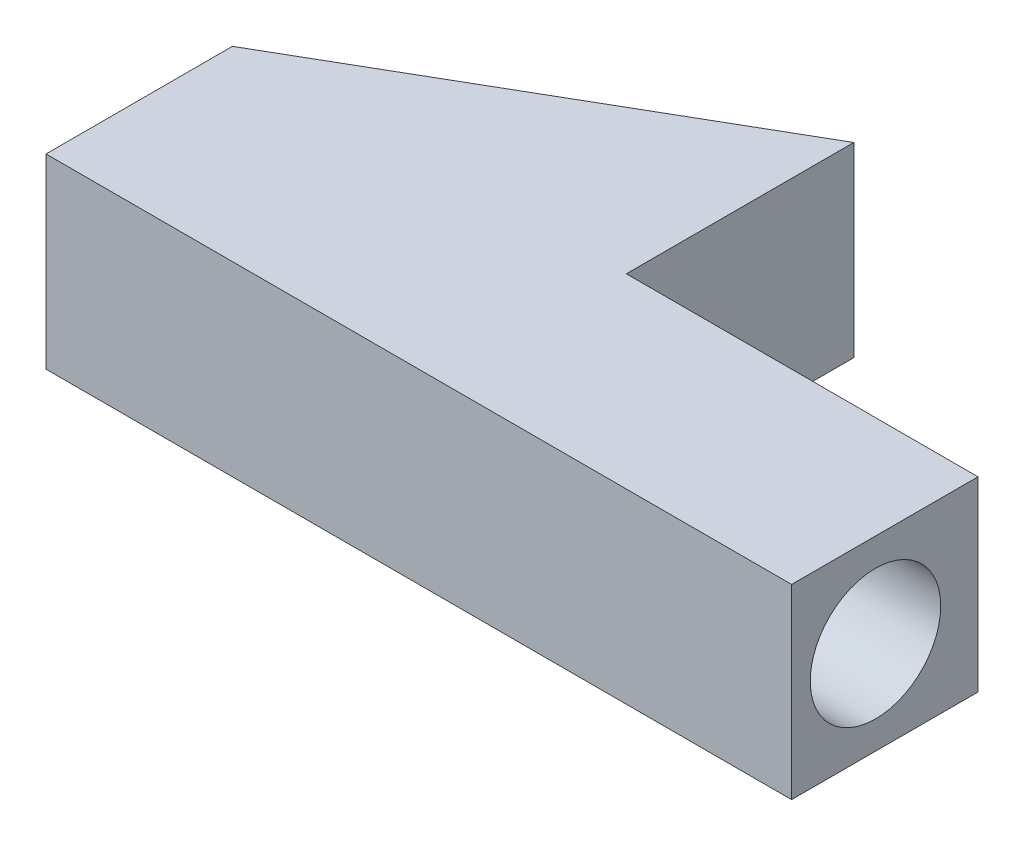
ISO-10303-21;
HEADER;
FILE_DESCRIPTION(('STEP AP214'),'2;1');
FILE_NAME('part.step','',(''),(''),'','','');
FILE_SCHEMA(('AUTOMOTIVE_DESIGN { 1 0 10303 214 1 1 1 1 }'));
ENDSEC;
DATA;
#1=APPLICATION_CONTEXT('core data for automotive mechanical design processes');
#2=APPLICATION_PROTOCOL_DEFINITION('international standard','automotive_design',2000,#1);
#3=PRODUCT_CONTEXT('',#1,'mechanical');
#4=PRODUCT('Part','Part','',(#3));
#5=PRODUCT_RELATED_PRODUCT_CATEGORY('part','',(#4));
#6=PRODUCT_DEFINITION_FORMATION('','',#4);
#7=PRODUCT_DEFINITION_CONTEXT('part definition',#1,'design');
#8=PRODUCT_DEFINITION('design','',#6,#7);
#9=PRODUCT_DEFINITION_SHAPE('','',#8);
#10=(LENGTH_UNIT() NAMED_UNIT(*) SI_UNIT(.MILLI.,.METRE.));
#11=(NAMED_UNIT(*) PLANE_ANGLE_UNIT() SI_UNIT($,.RADIAN.));
#12=(NAMED_UNIT(*) SI_UNIT($,.STERADIAN.) SOLID_ANGLE_UNIT());
#13=UNCERTAINTY_MEASURE_WITH_UNIT(LENGTH_MEASURE(1.E-05),#10,'distance_accuracy_value','');
#14=(GEOMETRIC_REPRESENTATION_CONTEXT(3) GLOBAL_UNCERTAINTY_ASSIGNED_CONTEXT((#13)) GLOBAL_UNIT_ASSIGNED_CONTEXT((#10,
#11,#12)) REPRESENTATION_CONTEXT('',''));
#15=CARTESIAN_POINT('',(0.,0.,0.));
#16=DIRECTION('',(0.,0.,1.));
#17=DIRECTION('',(1.,0.,0.));
#18=AXIS2_PLACEMENT_3D('',#15,#16,#17);
#19=CARTESIAN_POINT('',(20.,5.,0.));
#20=DIRECTION('',(-1.,0.,0.));
#21=DIRECTION('',(0.,0.,1.));
#22=AXIS2_PLACEMENT_3D('',#19,#20,#21);
#23=PLANE('',#22);
#24=CARTESIAN_POINT('',(20.,2.5,-0.25));
#25=DIRECTION('',(1.,0.,0.));
#26=DIRECTION('',(0.,0.,-1.));
#27=AXIS2_PLACEMENT_3D('',#24,#25,#26);
#28=CIRCLE('',#27,1.75);
#29=CARTESIAN_POINT('',(20.,2.5,-2.));
#30=VERTEX_POINT('',#29);
#31=EDGE_CURVE('E226',#30,#30,#28,.T.);
#32=ORIENTED_EDGE('',*,*,#31,.F.);
#33=EDGE_LOOP('',(#32));
#34=FACE_BOUND('',#33,.T.);
#35=DIRECTION('',(0.,0.,-1.));
#36=VECTOR('',#35,1.);
#37=CARTESIAN_POINT('',(20.,0.,0.));
#38=LINE('',#37,#36);
#39=CARTESIAN_POINT('',(20.,0.,2.));
#40=VERTEX_POINT('',#39);
#41=CARTESIAN_POINT('',(20.,0.,-3.));
#42=VERTEX_POINT('',#41);
#43=EDGE_CURVE('E116',#40,#42,#38,.T.);
#44=ORIENTED_EDGE('',*,*,#43,.T.);
#45=DIRECTION('',(0.,-1.,0.));
#46=VECTOR('',#45,1.);
#47=CARTESIAN_POINT('',(20.,5.,-3.));
#48=LINE('',#47,#46);
#49=CARTESIAN_POINT('',(20.,5.,-3.));
#50=VERTEX_POINT('',#49);
#51=EDGE_CURVE('E47',#50,#42,#48,.T.);
#52=ORIENTED_EDGE('',*,*,#51,.F.);
#53=DIRECTION('',(0.,0.,-1.));
#54=VECTOR('',#53,1.);
#55=CARTESIAN_POINT('',(20.,5.,0.));
#56=LINE('',#55,#54);
#57=CARTESIAN_POINT('',(20.,5.,2.));
#58=VERTEX_POINT('',#57);
#59=EDGE_CURVE('E89',#58,#50,#56,.T.);
#60=ORIENTED_EDGE('',*,*,#59,.F.);
#61=DIRECTION('',(0.,1.,0.));
#62=VECTOR('',#61,1.);
#63=CARTESIAN_POINT('',(20.,0.,2.));
#64=LINE('',#63,#62);
#65=EDGE_CURVE('E191',#40,#58,#64,.T.);
#66=ORIENTED_EDGE('',*,*,#65,.F.);
#67=EDGE_LOOP('',(#44,#52,#60,#66));
#68=FACE_BOUND('',#67,.T.);
#69=ADVANCED_FACE('F39',(#34,#68),#23,.F.);
#70=CARTESIAN_POINT('',(20.,5.,-3.));
#71=DIRECTION('',(0.,0.,1.));
#72=DIRECTION('',(1.,0.,0.));
#73=AXIS2_PLACEMENT_3D('',#70,#71,#72);
#74=PLANE('',#73);
#75=DIRECTION('',(-1.,0.,0.));
#76=VECTOR('',#75,1.);
#77=CARTESIAN_POINT('',(20.,0.,-3.));
#78=LINE('',#77,#76);
#79=CARTESIAN_POINT('',(10.5670630843636,0.,-3.));
#80=VERTEX_POINT('',#79);
#81=EDGE_CURVE('E121',#42,#80,#78,.T.);
#82=ORIENTED_EDGE('',*,*,#81,.T.);
#83=DIRECTION('',(0.,-1.,0.));
#84=VECTOR('',#83,1.);
#85=CARTESIAN_POINT('',(10.5670630843636,5.,-3.));
#86=LINE('',#85,#84);
#87=CARTESIAN_POINT('',(10.5670630843636,5.,-3.));
#88=VERTEX_POINT('',#87);
#89=EDGE_CURVE('E158',#88,#80,#86,.T.);
#90=ORIENTED_EDGE('',*,*,#89,.F.);
#91=DIRECTION('',(-1.,0.,0.));
#92=VECTOR('',#91,1.);
#93=CARTESIAN_POINT('',(20.,5.,-3.));
#94=LINE('',#93,#92);
#95=EDGE_CURVE('E131',#50,#88,#94,.T.);
#96=ORIENTED_EDGE('',*,*,#95,.F.);
#97=ORIENTED_EDGE('',*,*,#51,.T.);
#98=EDGE_LOOP('',(#82,#90,#96,#97));
#99=FACE_BOUND('',#98,.T.);
#100=ADVANCED_FACE('F166',(#99),#74,.F.);
#101=CARTESIAN_POINT('',(10.5670630843636,5.,-9.10089671630103));
#102=DIRECTION('',(-1.,0.,0.));
#103=DIRECTION('',(0.,0.,1.));
#104=AXIS2_PLACEMENT_3D('',#101,#102,#103);
#105=PLANE('',#104);
#106=DIRECTION('',(0.,0.,-1.));
#107=VECTOR('',#106,1.);
#108=CARTESIAN_POINT('',(10.5670630843636,0.,-9.10089671630103));
#109=LINE('',#108,#107);
#110=CARTESIAN_POINT('',(10.5670630843636,0.,-9.10089671630103));
#111=VERTEX_POINT('',#110);
#112=EDGE_CURVE('E146',#80,#111,#109,.T.);
#113=ORIENTED_EDGE('',*,*,#112,.T.);
#114=DIRECTION('',(0.,-1.,0.));
#115=VECTOR('',#114,1.);
#116=CARTESIAN_POINT('',(10.5670630843636,5.,-9.10089671630103));
#117=LINE('',#116,#115);
#118=CARTESIAN_POINT('',(10.5670630843636,5.,-9.10089671630103));
#119=VERTEX_POINT('',#118);
#120=EDGE_CURVE('E155',#119,#111,#117,.T.);
#121=ORIENTED_EDGE('',*,*,#120,.F.);
#122=DIRECTION('',(0.,0.,-1.));
#123=VECTOR('',#122,1.);
#124=CARTESIAN_POINT('',(10.5670630843636,5.,-9.10089671630103));
#125=LINE('',#124,#123);
#126=EDGE_CURVE('E135',#88,#119,#125,.T.);
#127=ORIENTED_EDGE('',*,*,#126,.F.);
#128=ORIENTED_EDGE('',*,*,#89,.T.);
#129=EDGE_LOOP('',(#113,#121,#127,#128));
#130=FACE_BOUND('',#129,.T.);
#131=ADVANCED_FACE('F177',(#130),#105,.F.);
#132=CARTESIAN_POINT('',(0.,5.,-3.));
#133=DIRECTION('',(0.499999999999998,0.,0.86602540378444));
#134=DIRECTION('',(0.86602540378444,0.,-0.499999999999998));
#135=AXIS2_PLACEMENT_3D('',#132,#133,#134);
#136=PLANE('',#135);
#137=CARTESIAN_POINT('',(5.19615242270664,2.5,-5.99999999999999));
#138=DIRECTION('',(-0.499999999999998,0.,-0.86602540378444));
#139=DIRECTION('',(-0.86602540378444,0.,0.499999999999998));
#140=AXIS2_PLACEMENT_3D('',#137,#138,#139);
#141=CIRCLE('',#140,1.5);
#142=CARTESIAN_POINT('',(3.89711431702998,2.5,-5.24999999999999));
#143=VERTEX_POINT('',#142);
#144=EDGE_CURVE('E117',#143,#143,#141,.T.);
#145=ORIENTED_EDGE('',*,*,#144,.F.);
#146=EDGE_LOOP('',(#145));
#147=FACE_BOUND('',#146,.T.);
#148=DIRECTION('',(-0.86602540378444,0.,0.499999999999998));
#149=VECTOR('',#148,1.);
#150=CARTESIAN_POINT('',(0.,0.,-3.));
#151=LINE('',#150,#149);
#152=CARTESIAN_POINT('',(0.,0.,-3.));
#153=VERTEX_POINT('',#152);
#154=EDGE_CURVE('E82',#111,#153,#151,.T.);
#155=ORIENTED_EDGE('',*,*,#154,.T.);
#156=DIRECTION('',(0.,-1.,0.));
#157=VECTOR('',#156,1.);
#158=CARTESIAN_POINT('',(0.,5.,-3.));
#159=LINE('',#158,#157);
#160=CARTESIAN_POINT('',(0.,5.,-3.));
#161=VERTEX_POINT('',#160);
#162=EDGE_CURVE('E142',#161,#153,#159,.T.);
#163=ORIENTED_EDGE('',*,*,#162,.F.);
#164=DIRECTION('',(-0.86602540378444,0.,0.499999999999998));
#165=VECTOR('',#164,1.);
#166=CARTESIAN_POINT('',(0.,5.,-3.));
#167=LINE('',#166,#165);
#168=EDGE_CURVE('E61',#119,#161,#167,.T.);
#169=ORIENTED_EDGE('',*,*,#168,.F.);
#170=ORIENTED_EDGE('',*,*,#120,.T.);
#171=EDGE_LOOP('',(#155,#163,#169,#170));
#172=FACE_BOUND('',#171,.T.);
#173=ADVANCED_FACE('F179',(#147,#172),#136,.F.);
#174=CARTESIAN_POINT('',(0.,5.,0.));
#175=DIRECTION('',(1.,0.,0.));
#176=DIRECTION('',(0.,0.,-1.));
#177=AXIS2_PLACEMENT_3D('',#174,#175,#176);
#178=PLANE('',#177);
#179=CARTESIAN_POINT('',(0.,2.5,-0.25));
#180=DIRECTION('',(1.,0.,0.));
#181=DIRECTION('',(0.,0.,-1.));
#182=AXIS2_PLACEMENT_3D('',#179,#180,#181);
#183=CIRCLE('',#182,1.75);
#184=CARTESIAN_POINT('',(0.,2.5,-2.));
#185=VERTEX_POINT('',#184);
#186=EDGE_CURVE('E112',#185,#185,#183,.F.);
#187=ORIENTED_EDGE('',*,*,#186,.F.);
#188=EDGE_LOOP('',(#187));
#189=FACE_BOUND('',#188,.T.);
#190=DIRECTION('',(0.,0.,1.));
#191=VECTOR('',#190,1.);
#192=CARTESIAN_POINT('',(0.,0.,0.));
#193=LINE('',#192,#191);
#194=CARTESIAN_POINT('',(0.,0.,2.));
#195=VERTEX_POINT('',#194);
#196=EDGE_CURVE('E132',#153,#195,#193,.T.);
#197=ORIENTED_EDGE('',*,*,#196,.T.);
#198=DIRECTION('',(0.,-1.,0.));
#199=VECTOR('',#198,1.);
#200=CARTESIAN_POINT('',(0.,5.,2.));
#201=LINE('',#200,#199);
#202=CARTESIAN_POINT('',(0.,5.,2.));
#203=VERTEX_POINT('',#202);
#204=EDGE_CURVE('E111',#203,#195,#201,.T.);
#205=ORIENTED_EDGE('',*,*,#204,.F.);
#206=DIRECTION('',(0.,0.,1.));
#207=VECTOR('',#206,1.);
#208=CARTESIAN_POINT('',(0.,5.,0.));
#209=LINE('',#208,#207);
#210=EDGE_CURVE('E140',#161,#203,#209,.T.);
#211=ORIENTED_EDGE('',*,*,#210,.F.);
#212=ORIENTED_EDGE('',*,*,#162,.T.);
#213=EDGE_LOOP('',(#197,#205,#211,#212));
#214=FACE_BOUND('',#213,.T.);
#215=ADVANCED_FACE('F183',(#189,#214),#178,.F.);
#216=CARTESIAN_POINT('',(0.,5.,0.));
#217=DIRECTION('',(0.,-1.,0.));
#218=DIRECTION('',(0.,0.,-1.));
#219=AXIS2_PLACEMENT_3D('',#216,#217,#218);
#220=PLANE('',#219);
#221=ORIENTED_EDGE('',*,*,#210,.T.);
#222=DIRECTION('',(-1.,0.,0.));
#223=VECTOR('',#222,1.);
#224=CARTESIAN_POINT('',(20.,5.,2.));
#225=LINE('',#224,#223);
#226=EDGE_CURVE('E124',#58,#203,#225,.T.);
#227=ORIENTED_EDGE('',*,*,#226,.F.);
#228=ORIENTED_EDGE('',*,*,#59,.T.);
#229=ORIENTED_EDGE('',*,*,#95,.T.);
#230=ORIENTED_EDGE('',*,*,#126,.T.);
#231=ORIENTED_EDGE('',*,*,#168,.T.);
#232=EDGE_LOOP('',(#221,#227,#228,#229,#230,#231));
#233=FACE_BOUND('',#232,.T.);
#234=ADVANCED_FACE('F186',(#233),#220,.F.);
#235=CARTESIAN_POINT('',(0.,0.,0.));
#236=DIRECTION('',(0.,-1.,0.));
#237=DIRECTION('',(0.,0.,-1.));
#238=AXIS2_PLACEMENT_3D('',#235,#236,#237);
#239=PLANE('',#238);
#240=ORIENTED_EDGE('',*,*,#43,.F.);
#241=DIRECTION('',(1.,0.,0.));
#242=VECTOR('',#241,1.);
#243=CARTESIAN_POINT('',(0.,0.,2.));
#244=LINE('',#243,#242);
#245=EDGE_CURVE('E194',#195,#40,#244,.T.);
#246=ORIENTED_EDGE('',*,*,#245,.F.);
#247=ORIENTED_EDGE('',*,*,#196,.F.);
#248=ORIENTED_EDGE('',*,*,#154,.F.);
#249=ORIENTED_EDGE('',*,*,#112,.F.);
#250=ORIENTED_EDGE('',*,*,#81,.F.);
#251=EDGE_LOOP('',(#240,#246,#247,#248,#249,#250));
#252=FACE_BOUND('',#251,.T.);
#253=ADVANCED_FACE('F171',(#252),#239,.T.);
#254=CARTESIAN_POINT('',(7.69615242270663,2.5,-1.6698729810778));
#255=DIRECTION('',(-0.499999999999998,0.,-0.86602540378444));
#256=DIRECTION('',(-0.86602540378444,0.,0.499999999999998));
#257=AXIS2_PLACEMENT_3D('',#254,#255,#256);
#258=CYLINDRICAL_SURFACE('',#257,1.5);
#259=CARTESIAN_POINT('',(7.69615242270663,2.5,-1.6698729810778));
#260=DIRECTION('',(-0.499999999999998,0.,-0.86602540378444));
#261=DIRECTION('',(-0.86602540378444,0.,0.499999999999998));
#262=AXIS2_PLACEMENT_3D('',#259,#260,#261);
#263=CIRCLE('',#262,1.5);
#264=CARTESIAN_POINT('',(7.14640839224793,3.85905923391883,-1.35247811710708));
#265=VERTEX_POINT('',#264);
#266=CARTESIAN_POINT('',(7.14640839224793,1.14094076608117,-1.35247811710708));
#267=VERTEX_POINT('',#266);
#268=EDGE_CURVE('E109',#265,#267,#263,.T.);
#269=ORIENTED_EDGE('',*,*,#268,.F.);
#270=CARTESIAN_POINT('',(7.14640839224793,3.85905923391883,-1.35247811710708));
#271=CARTESIAN_POINT('',(7.10585915328617,3.84631834628705,-1.36818567540474));
#272=CARTESIAN_POINT('',(7.0656920338948,3.8328311637144,-1.38425402403032));
#273=CARTESIAN_POINT('',(6.98612086494192,3.80432166478666,-1.41692501443093));
#274=CARTESIAN_POINT('',(6.94671690732767,3.78929916480528,-1.43352771995279));
#275=CARTESIAN_POINT('',(6.82925290101807,3.74170374835395,-1.48402663734861));
#276=CARTESIAN_POINT('',(6.75236651296231,3.70673571961558,-1.51844480187668));
#277=CARTESIAN_POINT('',(6.6010373815126,3.62919323230588,-1.58797741955255));
#278=CARTESIAN_POINT('',(6.52665281261778,3.58650682740958,-1.62309425195546));
#279=CARTESIAN_POINT('',(6.38286063588838,3.49293893057169,-1.69220419187225));
#280=CARTESIAN_POINT('',(6.31344060525633,3.44207900789984,-1.72619998071579));
#281=CARTESIAN_POINT('',(6.2001497612531,3.3464634337709,-1.78236356694367));
#282=CARTESIAN_POINT('',(6.15461293385366,3.30406123462271,-1.80515349788648));
#283=CARTESIAN_POINT('',(6.0683228912586,3.21371109080955,-1.8486326668607));
#284=CARTESIAN_POINT('',(6.02756322845224,3.16577079852527,-1.86932473111131));
#285=CARTESIAN_POINT('',(5.9520681570651,3.06312621943316,-1.90784061335673));
#286=CARTESIAN_POINT('',(5.91741959111793,3.008340830328,-1.92562285907005));
#287=CARTESIAN_POINT('',(5.8575798338876,2.89259652106346,-1.95643451275084));
#288=CARTESIAN_POINT('',(5.83236155207969,2.83165593370729,-1.96947753206216));
#289=CARTESIAN_POINT('',(5.80010747600243,2.72399973477888,-1.98618614256608));
#290=CARTESIAN_POINT('',(5.78988752261629,2.67849441206174,-1.99149061156411));
#291=CARTESIAN_POINT('',(5.77641288265558,2.58618649506995,-1.99848704268479));
#292=CARTESIAN_POINT('',(5.77315349657956,2.53938479769569,-2.00018144218268));
#293=CARTESIAN_POINT('',(5.77391212525375,2.44581296628798,-1.99978725725302));
#294=CARTESIAN_POINT('',(5.77793724255309,2.39904290758687,-1.99769498073397));
#295=CARTESIAN_POINT('',(5.7928890518903,2.30692985606582,-1.98993286531115));
#296=CARTESIAN_POINT('',(5.80382053246523,2.26158787632511,-1.98426054418101));
#297=CARTESIAN_POINT('',(5.83535314127007,2.16177728434167,-1.967931374402));
#298=CARTESIAN_POINT('',(5.85773651778347,2.10802691305873,-1.95635836839585));
#299=CARTESIAN_POINT('',(5.90993304936432,2.00532732919608,-1.92947378073628));
#300=CARTESIAN_POINT('',(5.93975762609165,1.95638566006584,-1.91415645257968));
#301=CARTESIAN_POINT('',(6.02221084481106,1.83873539617455,-1.87202051106032));
#302=CARTESIAN_POINT('',(6.0785482009996,1.77329701336704,-1.84340870180116));
#303=CARTESIAN_POINT('',(6.19977029869742,1.65234488340121,-1.78251465562344));
#304=CARTESIAN_POINT('',(6.26470864611701,1.59689900192256,-1.75020958907563));
#305=CARTESIAN_POINT('',(6.39420736515052,1.49935367414963,-1.68675783937827));
#306=CARTESIAN_POINT('',(6.45828823981391,1.45650596845019,-1.65576343941569));
#307=CARTESIAN_POINT('',(6.59008551093078,1.37712292082062,-1.5932065884873));
#308=CARTESIAN_POINT('',(6.65780691001783,1.34059657185893,-1.56164339764045));
#309=CARTESIAN_POINT('',(6.79441165442168,1.27407124653247,-1.49964376753783));
#310=CARTESIAN_POINT('',(6.86322276532452,1.24393102978903,-1.46919897271636));
#311=CARTESIAN_POINT('',(6.96817715438139,1.20250584078466,-1.42448695929341));
#312=CARTESIAN_POINT('',(7.00339844540587,1.18934490646229,-1.40976312923977));
#313=CARTESIAN_POINT('',(7.07444807515066,1.16423823226567,-1.38075598219934));
#314=CARTESIAN_POINT('',(7.11027638629971,1.15229243737069,-1.36647264528772));
#315=CARTESIAN_POINT('',(7.14640839224793,1.14094076608115,-1.35247811710711));
#316=B_SPLINE_CURVE_WITH_KNOTS('',3,(#270,#271,#272,#273,#274,#275,#276,#277,#278,#279,#280,
#281,#282,#283,#284,#285,#286,#287,#288,#289,#290,#291,#292,#293,#294,#295,#296,#297,#298,#299,
#300,#301,#302,#303,#304,#305,#306,#307,#308,#309,#310,#311,#312,#313,#314,#315),.UNSPECIFIED.,
.F.,.F.,(4,2,2,2,2,2,2,2,2,2,2,2,2,2,2,2,2,2,2,2,2,2,4),(0.,0.135917426039882,0.271851127075395,
0.545145354232878,0.822778410841076,1.09969049615781,1.29814325220497,1.49632499989586,
1.69712890048688,1.8973514344006,2.03756884548115,2.17769155730791,2.31795096543823,
2.45830772951989,2.63540882373436,2.81278344486238,3.08416091262205,3.35731720770851,
3.60619290202565,3.85541979541292,4.09836902758159,4.21948753459277,4.34060055499245),.UNSPECIFIED.);
#317=EDGE_CURVE('E52',#265,#267,#316,.T.);
#318=ORIENTED_EDGE('',*,*,#317,.T.);
#319=EDGE_LOOP('',(#269,#318));
#320=FACE_BOUND('',#319,.T.);
#321=ORIENTED_EDGE('',*,*,#144,.T.);
#322=EDGE_LOOP('',(#321));
#323=FACE_BOUND('',#322,.T.);
#324=ADVANCED_FACE('F107',(#320,#323),#258,.F.);
#325=CARTESIAN_POINT('',(7.69615242270663,2.5,-1.6698729810778));
#326=DIRECTION('',(-0.499999999999998,0.,-0.86602540378444));
#327=DIRECTION('',(-0.86602540378444,0.,0.499999999999998));
#328=AXIS2_PLACEMENT_3D('',#325,#326,#327);
#329=PLANE('',#328);
#330=CARTESIAN_POINT('',(5.23686027918559,2.5,-0.25));
#331=DIRECTION('',(-0.499999999999998,0.,-0.86602540378444));
#332=DIRECTION('',(0.86602540378444,0.,-0.499999999999998));
#333=AXIS2_PLACEMENT_3D('',#330,#331,#332);
#334=ELLIPSE('',#333,3.50000000000001,1.75);
#335=EDGE_CURVE('E11',#265,#267,#334,.T.);
#336=ORIENTED_EDGE('',*,*,#335,.F.);
#337=ORIENTED_EDGE('',*,*,#268,.T.);
#338=EDGE_LOOP('',(#336,#337));
#339=FACE_BOUND('',#338,.T.);
#340=ADVANCED_FACE('F114',(#339),#329,.T.);
#341=CARTESIAN_POINT('',(0.,0.,2.));
#342=DIRECTION('',(0.,0.,1.));
#343=DIRECTION('',(1.,0.,0.));
#344=AXIS2_PLACEMENT_3D('',#341,#342,#343);
#345=PLANE('',#344);
#346=ORIENTED_EDGE('',*,*,#204,.T.);
#347=ORIENTED_EDGE('',*,*,#245,.T.);
#348=ORIENTED_EDGE('',*,*,#65,.T.);
#349=ORIENTED_EDGE('',*,*,#226,.T.);
#350=EDGE_LOOP('',(#346,#347,#348,#349));
#351=FACE_BOUND('',#350,.T.);
#352=ADVANCED_FACE('F189',(#351),#345,.T.);
#353=CARTESIAN_POINT('',(-4.94974746830584,2.5,-0.25));
#354=DIRECTION('',(1.,0.,0.));
#355=DIRECTION('',(0.,0.,-1.));
#356=AXIS2_PLACEMENT_3D('',#353,#354,#355);
#357=CYLINDRICAL_SURFACE('',#356,1.75);
#358=ORIENTED_EDGE('',*,*,#186,.T.);
#359=EDGE_LOOP('',(#358));
#360=FACE_BOUND('',#359,.T.);
#361=ORIENTED_EDGE('',*,*,#31,.T.);
#362=EDGE_LOOP('',(#361));
#363=FACE_BOUND('',#362,.T.);
#364=ORIENTED_EDGE('',*,*,#335,.T.);
#365=ORIENTED_EDGE('',*,*,#317,.F.);
#366=EDGE_LOOP('',(#364,#365));
#367=FACE_BOUND('',#366,.T.);
#368=ADVANCED_FACE('F102',(#360,#363,#367),#357,.F.);
#369=CLOSED_SHELL('',(#69,#100,#131,#173,#215,#234,#253,#324,#340,#352,#368));
#370=MANIFOLD_SOLID_BREP('B2',#369);
#371=ADVANCED_BREP_SHAPE_REPRESENTATION('',(#18,#370),#14);
#372=SHAPE_DEFINITION_REPRESENTATION(#9,#371);
ENDSEC;
END-ISO-10303-21;
